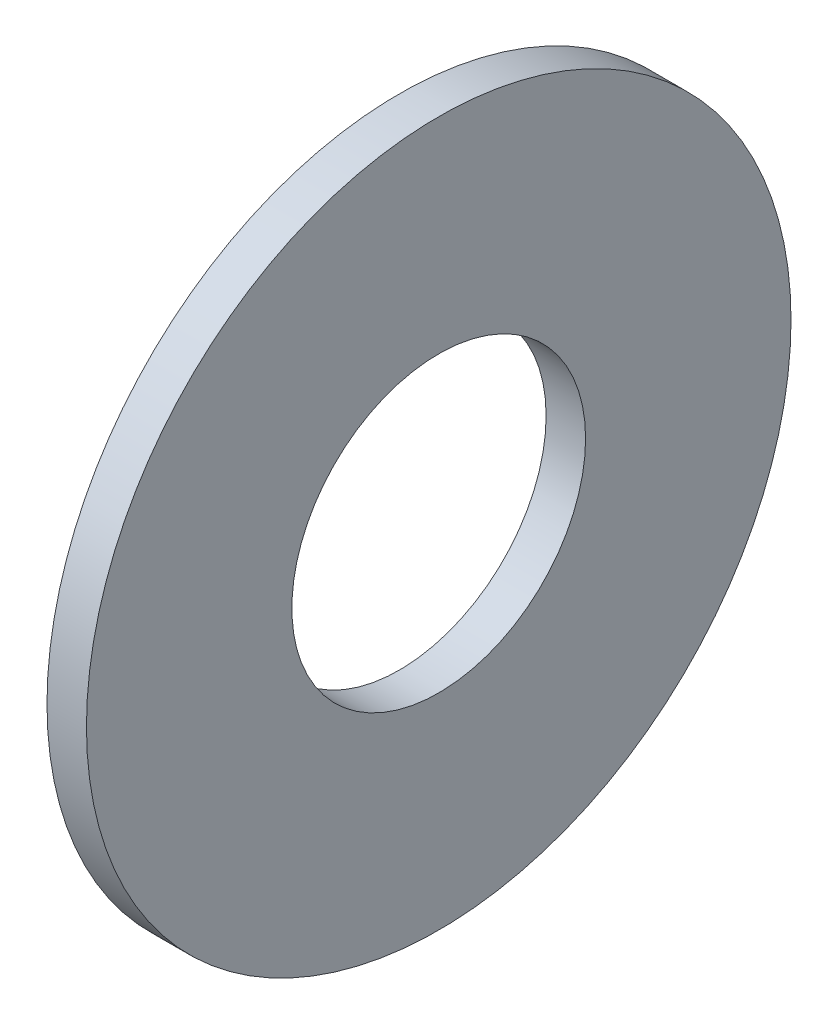
ISO-10303-21;
HEADER;
FILE_DESCRIPTION(('STEP AP214'),'2;1');
FILE_NAME('part.step','',(''),(''),'','','');
FILE_SCHEMA(('AUTOMOTIVE_DESIGN { 1 0 10303 214 1 1 1 1 }'));
ENDSEC;
DATA;
#1=APPLICATION_CONTEXT('core data for automotive mechanical design processes');
#2=APPLICATION_PROTOCOL_DEFINITION('international standard','automotive_design',2000,#1);
#3=PRODUCT_CONTEXT('',#1,'mechanical');
#4=PRODUCT('Part','Part','',(#3));
#5=PRODUCT_RELATED_PRODUCT_CATEGORY('part','',(#4));
#6=PRODUCT_DEFINITION_FORMATION('','',#4);
#7=PRODUCT_DEFINITION_CONTEXT('part definition',#1,'design');
#8=PRODUCT_DEFINITION('design','',#6,#7);
#9=PRODUCT_DEFINITION_SHAPE('','',#8);
#10=(LENGTH_UNIT() NAMED_UNIT(*) SI_UNIT(.MILLI.,.METRE.));
#11=(NAMED_UNIT(*) PLANE_ANGLE_UNIT() SI_UNIT($,.RADIAN.));
#12=(NAMED_UNIT(*) SI_UNIT($,.STERADIAN.) SOLID_ANGLE_UNIT());
#13=UNCERTAINTY_MEASURE_WITH_UNIT(LENGTH_MEASURE(1.E-05),#10,'distance_accuracy_value','');
#14=(GEOMETRIC_REPRESENTATION_CONTEXT(3) GLOBAL_UNCERTAINTY_ASSIGNED_CONTEXT((#13)) GLOBAL_UNIT_ASSIGNED_CONTEXT((#10,
#11,#12)) REPRESENTATION_CONTEXT('',''));
#15=CARTESIAN_POINT('',(0.,0.,0.));
#16=DIRECTION('',(0.,0.,1.));
#17=DIRECTION('',(1.,0.,0.));
#18=AXIS2_PLACEMENT_3D('',#15,#16,#17);
#19=CARTESIAN_POINT('',(1.6002,0.,0.));
#20=DIRECTION('',(1.,0.,0.));
#21=DIRECTION('',(0.,0.,-1.));
#22=AXIS2_PLACEMENT_3D('',#19,#20,#21);
#23=PLANE('',#22);
#24=CARTESIAN_POINT('',(1.6002,0.,0.));
#25=DIRECTION('',(1.,0.,0.));
#26=DIRECTION('',(0.,0.,-1.));
#27=AXIS2_PLACEMENT_3D('',#24,#25,#26);
#28=CIRCLE('',#27,14.2875);
#29=CARTESIAN_POINT('',(1.6002,0.,-14.2875));
#30=VERTEX_POINT('',#29);
#31=EDGE_CURVE('E10',#30,#30,#28,.T.);
#32=ORIENTED_EDGE('',*,*,#31,.T.);
#33=EDGE_LOOP('',(#32));
#34=FACE_BOUND('',#33,.T.);
#35=CARTESIAN_POINT('',(1.6002,0.,0.));
#36=DIRECTION('',(1.,0.,0.));
#37=DIRECTION('',(0.,0.,-1.));
#38=AXIS2_PLACEMENT_3D('',#35,#36,#37);
#39=CIRCLE('',#38,5.9563);
#40=CARTESIAN_POINT('',(1.6002,0.,-5.9563));
#41=VERTEX_POINT('',#40);
#42=EDGE_CURVE('E43',#41,#41,#39,.T.);
#43=ORIENTED_EDGE('',*,*,#42,.F.);
#44=EDGE_LOOP('',(#43));
#45=FACE_BOUND('',#44,.T.);
#46=ADVANCED_FACE('F32',(#34,#45),#23,.T.);
#47=CARTESIAN_POINT('',(0.,0.,0.));
#48=DIRECTION('',(1.,0.,0.));
#49=DIRECTION('',(0.,0.,-1.));
#50=AXIS2_PLACEMENT_3D('',#47,#48,#49);
#51=PLANE('',#50);
#52=CARTESIAN_POINT('',(0.,0.,0.));
#53=DIRECTION('',(1.,0.,0.));
#54=DIRECTION('',(0.,0.,-1.));
#55=AXIS2_PLACEMENT_3D('',#52,#53,#54);
#56=CIRCLE('',#55,14.2875);
#57=CARTESIAN_POINT('',(0.,0.,-14.2875));
#58=VERTEX_POINT('',#57);
#59=EDGE_CURVE('E36',#58,#58,#56,.T.);
#60=ORIENTED_EDGE('',*,*,#59,.F.);
#61=EDGE_LOOP('',(#60));
#62=FACE_BOUND('',#61,.T.);
#63=CARTESIAN_POINT('',(0.,0.,0.));
#64=DIRECTION('',(1.,0.,0.));
#65=DIRECTION('',(0.,0.,-1.));
#66=AXIS2_PLACEMENT_3D('',#63,#64,#65);
#67=CIRCLE('',#66,5.9563);
#68=CARTESIAN_POINT('',(0.,0.,-5.9563));
#69=VERTEX_POINT('',#68);
#70=EDGE_CURVE('E45',#69,#69,#67,.T.);
#71=ORIENTED_EDGE('',*,*,#70,.T.);
#72=EDGE_LOOP('',(#71));
#73=FACE_BOUND('',#72,.T.);
#74=ADVANCED_FACE('F55',(#62,#73),#51,.F.);
#75=CARTESIAN_POINT('',(1.6002,0.,0.));
#76=DIRECTION('',(-1.,0.,0.));
#77=DIRECTION('',(0.,0.,1.));
#78=AXIS2_PLACEMENT_3D('',#75,#76,#77);
#79=CYLINDRICAL_SURFACE('',#78,14.2875);
#80=ORIENTED_EDGE('',*,*,#31,.F.);
#81=EDGE_LOOP('',(#80));
#82=FACE_BOUND('',#81,.T.);
#83=ORIENTED_EDGE('',*,*,#59,.T.);
#84=EDGE_LOOP('',(#83));
#85=FACE_BOUND('',#84,.T.);
#86=ADVANCED_FACE('F34',(#82,#85),#79,.T.);
#87=CARTESIAN_POINT('',(1.6002,0.,0.));
#88=DIRECTION('',(-1.,0.,0.));
#89=DIRECTION('',(0.,0.,1.));
#90=AXIS2_PLACEMENT_3D('',#87,#88,#89);
#91=CYLINDRICAL_SURFACE('',#90,5.9563);
#92=ORIENTED_EDGE('',*,*,#42,.T.);
#93=EDGE_LOOP('',(#92));
#94=FACE_BOUND('',#93,.T.);
#95=ORIENTED_EDGE('',*,*,#70,.F.);
#96=EDGE_LOOP('',(#95));
#97=FACE_BOUND('',#96,.T.);
#98=ADVANCED_FACE('F51',(#94,#97),#91,.F.);
#99=CLOSED_SHELL('',(#46,#74,#86,#98));
#100=MANIFOLD_SOLID_BREP('B2',#99);
#101=ADVANCED_BREP_SHAPE_REPRESENTATION('',(#18,#100),#14);
#102=SHAPE_DEFINITION_REPRESENTATION(#9,#101);
ENDSEC;
END-ISO-10303-21;
